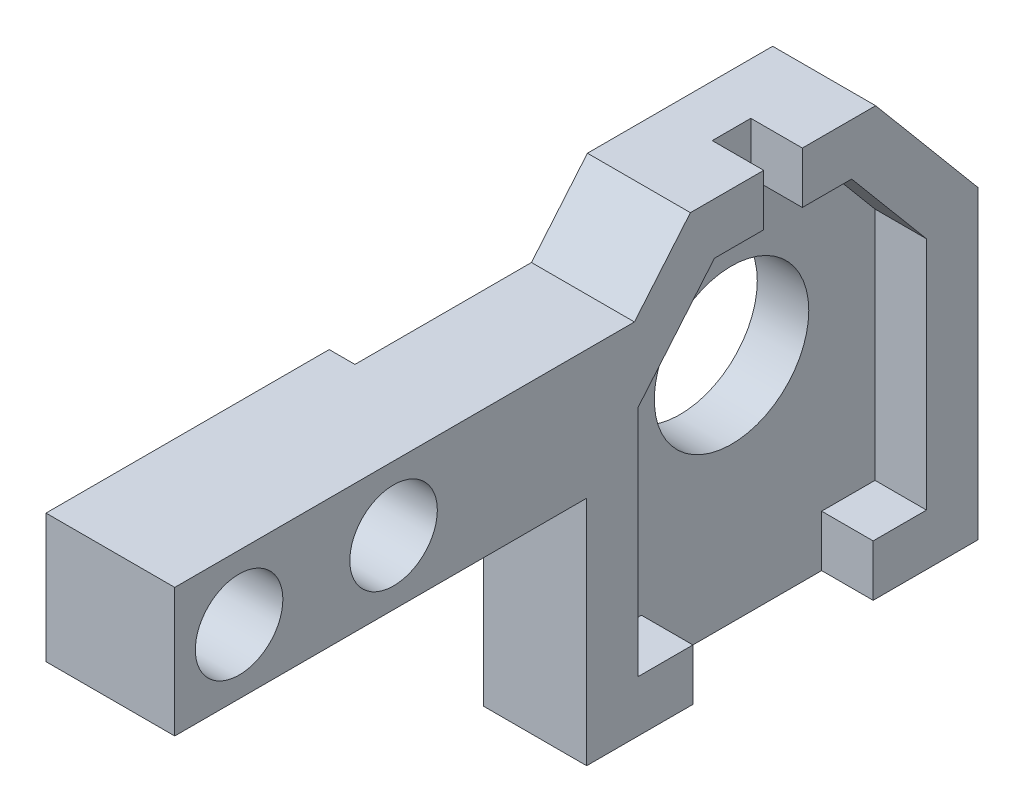
ISO-10303-21;
HEADER;
FILE_DESCRIPTION(('STEP AP214'),'2;1');
FILE_NAME('part.step','',(''),(''),'','','');
FILE_SCHEMA(('AUTOMOTIVE_DESIGN { 1 0 10303 214 1 1 1 1 }'));
ENDSEC;
DATA;
#1=APPLICATION_CONTEXT('core data for automotive mechanical design processes');
#2=APPLICATION_PROTOCOL_DEFINITION('international standard','automotive_design',2000,#1);
#3=PRODUCT_CONTEXT('',#1,'mechanical');
#4=PRODUCT('Part','Part','',(#3));
#5=PRODUCT_RELATED_PRODUCT_CATEGORY('part','',(#4));
#6=PRODUCT_DEFINITION_FORMATION('','',#4);
#7=PRODUCT_DEFINITION_CONTEXT('part definition',#1,'design');
#8=PRODUCT_DEFINITION('design','',#6,#7);
#9=PRODUCT_DEFINITION_SHAPE('','',#8);
#10=(LENGTH_UNIT() NAMED_UNIT(*) SI_UNIT(.MILLI.,.METRE.));
#11=(NAMED_UNIT(*) PLANE_ANGLE_UNIT() SI_UNIT($,.RADIAN.));
#12=(NAMED_UNIT(*) SI_UNIT($,.STERADIAN.) SOLID_ANGLE_UNIT());
#13=UNCERTAINTY_MEASURE_WITH_UNIT(LENGTH_MEASURE(1.E-05),#10,'distance_accuracy_value','');
#14=(GEOMETRIC_REPRESENTATION_CONTEXT(3) GLOBAL_UNCERTAINTY_ASSIGNED_CONTEXT((#13)) GLOBAL_UNIT_ASSIGNED_CONTEXT((#10,
#11,#12)) REPRESENTATION_CONTEXT('',''));
#15=CARTESIAN_POINT('',(0.,0.,0.));
#16=DIRECTION('',(0.,0.,1.));
#17=DIRECTION('',(1.,0.,0.));
#18=AXIS2_PLACEMENT_3D('',#15,#16,#17);
#19=CARTESIAN_POINT('',(0.,0.,0.));
#20=DIRECTION('',(-1.,0.,0.));
#21=DIRECTION('',(0.,0.,1.));
#22=AXIS2_PLACEMENT_3D('',#19,#20,#21);
#23=PLANE('',#22);
#24=CARTESIAN_POINT('',(0.,1.90865976235804,0.482116569244563));
#25=DIRECTION('',(1.,0.,0.));
#26=DIRECTION('',(0.,0.,-1.));
#27=AXIS2_PLACEMENT_3D('',#24,#25,#26);
#28=CIRCLE('',#27,3.);
#29=CARTESIAN_POINT('',(0.,1.90865976235804,-2.51788343075544));
#30=VERTEX_POINT('',#29);
#31=EDGE_CURVE('E228',#30,#30,#28,.T.);
#32=ORIENTED_EDGE('',*,*,#31,.F.);
#33=EDGE_LOOP('',(#32));
#34=FACE_BOUND('',#33,.T.);
#35=DIRECTION('',(0.,1.,0.));
#36=VECTOR('',#35,1.);
#37=CARTESIAN_POINT('',(0.,7.49865976235804,1.23211656924456));
#38=LINE('',#37,#36);
#39=CARTESIAN_POINT('',(0.,7.49865976235804,1.23211656924456));
#40=VERTEX_POINT('',#39);
#41=CARTESIAN_POINT('',(0.,9.49865976235804,1.23211656924456));
#42=VERTEX_POINT('',#41);
#43=EDGE_CURVE('E65',#40,#42,#38,.T.);
#44=ORIENTED_EDGE('',*,*,#43,.F.);
#45=DIRECTION('',(0.,0.,-1.));
#46=VECTOR('',#45,1.);
#47=CARTESIAN_POINT('',(0.,7.49865976235804,3.14728681258254));
#48=LINE('',#47,#46);
#49=CARTESIAN_POINT('',(0.,7.49865976235804,3.14728681258254));
#50=VERTEX_POINT('',#49);
#51=EDGE_CURVE('E403',#50,#40,#48,.T.);
#52=ORIENTED_EDGE('',*,*,#51,.F.);
#53=DIRECTION('',(0.,0.766044443118982,-0.642787609686534));
#54=VECTOR('',#53,1.);
#55=CARTESIAN_POINT('',(0.,3.96865976235804,6.1093085106383));
#56=LINE('',#55,#54);
#57=CARTESIAN_POINT('',(0.,3.96865976235804,6.1093085106383));
#58=VERTEX_POINT('',#57);
#59=EDGE_CURVE('E399',#58,#50,#56,.T.);
#60=ORIENTED_EDGE('',*,*,#59,.F.);
#61=DIRECTION('',(0.,1.,0.));
#62=VECTOR('',#61,1.);
#63=CARTESIAN_POINT('',(0.,3.96865976235804,6.1093085106383));
#64=LINE('',#63,#62);
#65=CARTESIAN_POINT('',(0.,-5.09134023764196,6.1093085106383));
#66=VERTEX_POINT('',#65);
#67=EDGE_CURVE('E394',#66,#58,#64,.T.);
#68=ORIENTED_EDGE('',*,*,#67,.F.);
#69=DIRECTION('',(0.,0.,1.));
#70=VECTOR('',#69,1.);
#71=CARTESIAN_POINT('',(0.,-5.09134023764196,6.1093085106383));
#72=LINE('',#71,#70);
#73=CARTESIAN_POINT('',(0.,-5.09134023764196,3.98211656924456));
#74=VERTEX_POINT('',#73);
#75=EDGE_CURVE('E390',#74,#66,#72,.T.);
#76=ORIENTED_EDGE('',*,*,#75,.F.);
#77=DIRECTION('',(0.,1.,0.));
#78=VECTOR('',#77,1.);
#79=CARTESIAN_POINT('',(0.,-5.09134023764196,3.98211656924456));
#80=LINE('',#79,#78);
#81=CARTESIAN_POINT('',(0.,-7.09134023764196,3.98211656924456));
#82=VERTEX_POINT('',#81);
#83=EDGE_CURVE('E408',#82,#74,#80,.T.);
#84=ORIENTED_EDGE('',*,*,#83,.F.);
#85=DIRECTION('',(0.,0.,-1.));
#86=VECTOR('',#85,1.);
#87=CARTESIAN_POINT('',(0.,-7.09134023764196,-7.0906914893617));
#88=LINE('',#87,#86);
#89=CARTESIAN_POINT('',(0.,-7.09134023764196,-3.01788343075544));
#90=VERTEX_POINT('',#89);
#91=EDGE_CURVE('E248',#82,#90,#88,.T.);
#92=ORIENTED_EDGE('',*,*,#91,.T.);
#93=DIRECTION('',(0.,-1.,0.));
#94=VECTOR('',#93,1.);
#95=CARTESIAN_POINT('',(0.,-5.09134023764196,-3.01788343075544));
#96=LINE('',#95,#94);
#97=CARTESIAN_POINT('',(0.,-5.09134023764196,-3.01788343075544));
#98=VERTEX_POINT('',#97);
#99=EDGE_CURVE('E311',#98,#90,#96,.T.);
#100=ORIENTED_EDGE('',*,*,#99,.F.);
#101=DIRECTION('',(0.,0.,1.));
#102=VECTOR('',#101,1.);
#103=CARTESIAN_POINT('',(0.,-5.09134023764196,-3.01788343075544));
#104=LINE('',#103,#102);
#105=CARTESIAN_POINT('',(0.,-5.09134023764196,-5.0906914893617));
#106=VERTEX_POINT('',#105);
#107=EDGE_CURVE('E307',#106,#98,#104,.T.);
#108=ORIENTED_EDGE('',*,*,#107,.F.);
#109=DIRECTION('',(0.,-1.,0.));
#110=VECTOR('',#109,1.);
#111=CARTESIAN_POINT('',(0.,4.03347195004924,-5.0906914893617));
#112=LINE('',#111,#110);
#113=CARTESIAN_POINT('',(0.,4.03347195004924,-5.0906914893617));
#114=VERTEX_POINT('',#113);
#115=EDGE_CURVE('E303',#114,#106,#112,.T.);
#116=ORIENTED_EDGE('',*,*,#115,.F.);
#117=DIRECTION('',(0.,-0.766044443118981,-0.642787609686535));
#118=VECTOR('',#117,1.);
#119=CARTESIAN_POINT('',(0.,4.03347195004924,-5.0906914893617));
#120=LINE('',#119,#118);
#121=CARTESIAN_POINT('',(0.,7.49865976235804,-2.18305367409341));
#122=VERTEX_POINT('',#121);
#123=EDGE_CURVE('E298',#122,#114,#120,.T.);
#124=ORIENTED_EDGE('',*,*,#123,.F.);
#125=DIRECTION('',(0.,0.,-1.));
#126=VECTOR('',#125,1.);
#127=CARTESIAN_POINT('',(0.,7.49865976235804,-0.267883430755437));
#128=LINE('',#127,#126);
#129=CARTESIAN_POINT('',(0.,7.49865976235804,-0.267883430755437));
#130=VERTEX_POINT('',#129);
#131=EDGE_CURVE('E294',#130,#122,#128,.T.);
#132=ORIENTED_EDGE('',*,*,#131,.F.);
#133=DIRECTION('',(0.,-1.,0.));
#134=VECTOR('',#133,1.);
#135=CARTESIAN_POINT('',(0.,7.49865976235804,-0.267883430755437));
#136=LINE('',#135,#134);
#137=CARTESIAN_POINT('',(0.,9.49865976235804,-0.267883430755437));
#138=VERTEX_POINT('',#137);
#139=EDGE_CURVE('E315',#138,#130,#136,.T.);
#140=ORIENTED_EDGE('',*,*,#139,.F.);
#141=DIRECTION('',(0.,0.,1.));
#142=VECTOR('',#141,1.);
#143=CARTESIAN_POINT('',(0.,9.49865976235804,4.07990212889255));
#144=LINE('',#143,#142);
#145=EDGE_CURVE('E251',#138,#42,#144,.T.);
#146=ORIENTED_EDGE('',*,*,#145,.T.);
#147=EDGE_LOOP('',(#44,#52,#60,#68,#76,#84,#92,#100,#108,#116,#124,#132,#140,#146));
#148=FACE_BOUND('',#147,.T.);
#149=ADVANCED_FACE('F39',(#34,#148),#23,.F.);
#150=CARTESIAN_POINT('',(-2.,-7.09134023764196,-7.0906914893617));
#151=DIRECTION('',(0.,-1.,0.));
#152=DIRECTION('',(0.,0.,-1.));
#153=AXIS2_PLACEMENT_3D('',#150,#151,#152);
#154=PLANE('',#153);
#155=ORIENTED_EDGE('',*,*,#91,.F.);
#156=DIRECTION('',(-1.,0.,0.));
#157=VECTOR('',#156,1.);
#158=CARTESIAN_POINT('',(2.,-7.09134023764196,3.98211656924456));
#159=LINE('',#158,#157);
#160=CARTESIAN_POINT('',(2.,-7.09134023764196,3.98211656924456));
#161=VERTEX_POINT('',#160);
#162=EDGE_CURVE('E416',#161,#82,#159,.T.);
#163=ORIENTED_EDGE('',*,*,#162,.F.);
#164=DIRECTION('',(0.,0.,-1.));
#165=VECTOR('',#164,1.);
#166=CARTESIAN_POINT('',(2.,-7.09134023764196,8.1093085106383));
#167=LINE('',#166,#165);
#168=CARTESIAN_POINT('',(2.,-7.09134023764196,8.1093085106383));
#169=VERTEX_POINT('',#168);
#170=EDGE_CURVE('E378',#169,#161,#167,.T.);
#171=ORIENTED_EDGE('',*,*,#170,.F.);
#172=DIRECTION('',(1.,0.,0.));
#173=VECTOR('',#172,1.);
#174=CARTESIAN_POINT('',(-2.,-7.09134023764196,8.1093085106383));
#175=LINE('',#174,#173);
#176=CARTESIAN_POINT('',(-2.,-7.09134023764196,8.1093085106383));
#177=VERTEX_POINT('',#176);
#178=EDGE_CURVE('E11',#177,#169,#175,.T.);
#179=ORIENTED_EDGE('',*,*,#178,.F.);
#180=DIRECTION('',(0.,0.,-1.));
#181=VECTOR('',#180,1.);
#182=CARTESIAN_POINT('',(-2.,-7.09134023764196,-7.0906914893617));
#183=LINE('',#182,#181);
#184=CARTESIAN_POINT('',(-2.,-7.09134023764196,-7.0906914893617));
#185=VERTEX_POINT('',#184);
#186=EDGE_CURVE('E236',#177,#185,#183,.T.);
#187=ORIENTED_EDGE('',*,*,#186,.T.);
#188=DIRECTION('',(1.,0.,0.));
#189=VECTOR('',#188,1.);
#190=CARTESIAN_POINT('',(-2.,-7.09134023764196,-7.0906914893617));
#191=LINE('',#190,#189);
#192=CARTESIAN_POINT('',(2.,-7.09134023764196,-7.0906914893617));
#193=VERTEX_POINT('',#192);
#194=EDGE_CURVE('E43',#185,#193,#191,.T.);
#195=ORIENTED_EDGE('',*,*,#194,.T.);
#196=DIRECTION('',(0.,0.,-1.));
#197=VECTOR('',#196,1.);
#198=CARTESIAN_POINT('',(2.,-7.09134023764196,-3.01788343075544));
#199=LINE('',#198,#197);
#200=CARTESIAN_POINT('',(2.,-7.09134023764196,-3.01788343075544));
#201=VERTEX_POINT('',#200);
#202=EDGE_CURVE('E279',#201,#193,#199,.T.);
#203=ORIENTED_EDGE('',*,*,#202,.F.);
#204=DIRECTION('',(-1.,0.,0.));
#205=VECTOR('',#204,1.);
#206=CARTESIAN_POINT('',(2.,-7.09134023764196,-3.01788343075544));
#207=LINE('',#206,#205);
#208=EDGE_CURVE('E327',#201,#90,#207,.T.);
#209=ORIENTED_EDGE('',*,*,#208,.T.);
#210=EDGE_LOOP('',(#155,#163,#171,#179,#187,#195,#203,#209));
#211=FACE_BOUND('',#210,.T.);
#212=ADVANCED_FACE('F41',(#211),#154,.T.);
#213=CARTESIAN_POINT('',(-2.,-7.09134023764196,8.1093085106383));
#214=DIRECTION('',(0.,0.,1.));
#215=DIRECTION('',(0.,-1.,0.));
#216=AXIS2_PLACEMENT_3D('',#213,#214,#215);
#217=PLANE('',#216);
#218=DIRECTION('',(1.,0.,0.));
#219=VECTOR('',#218,1.);
#220=CARTESIAN_POINT('',(-3.,1.90865976235804,8.1093085106383));
#221=LINE('',#220,#219);
#222=CARTESIAN_POINT('',(-2.,1.90865976235804,8.1093085106383));
#223=VERTEX_POINT('',#222);
#224=CARTESIAN_POINT('',(2.,1.90865976235804,8.1093085106383));
#225=VERTEX_POINT('',#224);
#226=EDGE_CURVE('E211',#223,#225,#221,.T.);
#227=ORIENTED_EDGE('',*,*,#226,.F.);
#228=DIRECTION('',(0.,-1.,0.));
#229=VECTOR('',#228,1.);
#230=CARTESIAN_POINT('',(-2.,-7.09134023764196,8.1093085106383));
#231=LINE('',#230,#229);
#232=EDGE_CURVE('E224',#223,#177,#231,.T.);
#233=ORIENTED_EDGE('',*,*,#232,.T.);
#234=ORIENTED_EDGE('',*,*,#178,.T.);
#235=DIRECTION('',(0.,-1.,0.));
#236=VECTOR('',#235,1.);
#237=CARTESIAN_POINT('',(2.,4.69660023089044,8.1093085106383));
#238=LINE('',#237,#236);
#239=EDGE_CURVE('E226',#225,#169,#238,.T.);
#240=ORIENTED_EDGE('',*,*,#239,.F.);
#241=EDGE_LOOP('',(#227,#233,#234,#240));
#242=FACE_BOUND('',#241,.T.);
#243=ADVANCED_FACE('F223',(#242),#217,.T.);
#244=CARTESIAN_POINT('',(-2.,4.69660023089044,8.1093085106383));
#245=DIRECTION('',(0.,0.642787609686534,0.766044443118982));
#246=DIRECTION('',(0.,-0.766044443118982,0.642787609686534));
#247=AXIS2_PLACEMENT_3D('',#244,#245,#246);
#248=PLANE('',#247);
#249=DIRECTION('',(1.,0.,0.));
#250=VECTOR('',#249,1.);
#251=CARTESIAN_POINT('',(-3.,6.90865976235804,6.25317017364167));
#252=LINE('',#251,#250);
#253=CARTESIAN_POINT('',(-2.,6.90865976235804,6.25317017364167));
#254=VERTEX_POINT('',#253);
#255=CARTESIAN_POINT('',(2.,6.90865976235804,6.25317017364167));
#256=VERTEX_POINT('',#255);
#257=EDGE_CURVE('E368',#254,#256,#252,.T.);
#258=ORIENTED_EDGE('',*,*,#257,.T.);
#259=DIRECTION('',(0.,-0.766044443118982,0.642787609686534));
#260=VECTOR('',#259,1.);
#261=CARTESIAN_POINT('',(2.,4.69660023089044,8.1093085106383));
#262=LINE('',#261,#260);
#263=CARTESIAN_POINT('',(2.,9.49865976235804,4.07990212889255));
#264=VERTEX_POINT('',#263);
#265=EDGE_CURVE('E370',#264,#256,#262,.T.);
#266=ORIENTED_EDGE('',*,*,#265,.F.);
#267=DIRECTION('',(1.,0.,0.));
#268=VECTOR('',#267,1.);
#269=CARTESIAN_POINT('',(-2.,9.49865976235804,4.07990212889255));
#270=LINE('',#269,#268);
#271=CARTESIAN_POINT('',(-2.,9.49865976235804,4.07990212889255));
#272=VERTEX_POINT('',#271);
#273=EDGE_CURVE('E49',#272,#264,#270,.T.);
#274=ORIENTED_EDGE('',*,*,#273,.F.);
#275=DIRECTION('',(0.,-0.766044443118982,0.642787609686534));
#276=VECTOR('',#275,1.);
#277=CARTESIAN_POINT('',(-2.,4.69660023089044,8.1093085106383));
#278=LINE('',#277,#276);
#279=EDGE_CURVE('E238',#272,#254,#278,.T.);
#280=ORIENTED_EDGE('',*,*,#279,.T.);
#281=EDGE_LOOP('',(#258,#266,#274,#280));
#282=FACE_BOUND('',#281,.T.);
#283=ADVANCED_FACE('F366',(#282),#248,.T.);
#284=CARTESIAN_POINT('',(-2.,9.49865976235804,4.07990212889255));
#285=DIRECTION('',(0.,1.,0.));
#286=DIRECTION('',(0.,0.,1.));
#287=AXIS2_PLACEMENT_3D('',#284,#285,#286);
#288=PLANE('',#287);
#289=ORIENTED_EDGE('',*,*,#145,.F.);
#290=DIRECTION('',(-1.,0.,0.));
#291=VECTOR('',#290,1.);
#292=CARTESIAN_POINT('',(2.,9.49865976235804,-0.267883430755437));
#293=LINE('',#292,#291);
#294=CARTESIAN_POINT('',(2.,9.49865976235804,-0.267883430755437));
#295=VERTEX_POINT('',#294);
#296=EDGE_CURVE('E323',#295,#138,#293,.T.);
#297=ORIENTED_EDGE('',*,*,#296,.F.);
#298=DIRECTION('',(0.,0.,1.));
#299=VECTOR('',#298,1.);
#300=CARTESIAN_POINT('',(2.,9.49865976235804,-0.267883430755437));
#301=LINE('',#300,#299);
#302=CARTESIAN_POINT('',(2.,9.49865976235804,-3.11566899040342));
#303=VERTEX_POINT('',#302);
#304=EDGE_CURVE('E284',#303,#295,#301,.T.);
#305=ORIENTED_EDGE('',*,*,#304,.F.);
#306=DIRECTION('',(1.,0.,0.));
#307=VECTOR('',#306,1.);
#308=CARTESIAN_POINT('',(-2.,9.49865976235804,-3.11566899040342));
#309=LINE('',#308,#307);
#310=CARTESIAN_POINT('',(-2.,9.49865976235804,-3.11566899040342));
#311=VERTEX_POINT('',#310);
#312=EDGE_CURVE('E257',#311,#303,#309,.T.);
#313=ORIENTED_EDGE('',*,*,#312,.F.);
#314=DIRECTION('',(0.,0.,1.));
#315=VECTOR('',#314,1.);
#316=CARTESIAN_POINT('',(-2.,9.49865976235804,4.07990212889255));
#317=LINE('',#316,#315);
#318=EDGE_CURVE('E244',#311,#272,#317,.T.);
#319=ORIENTED_EDGE('',*,*,#318,.T.);
#320=ORIENTED_EDGE('',*,*,#273,.T.);
#321=DIRECTION('',(0.,0.,1.));
#322=VECTOR('',#321,1.);
#323=CARTESIAN_POINT('',(2.,9.49865976235804,4.07990212889255));
#324=LINE('',#323,#322);
#325=CARTESIAN_POINT('',(2.,9.49865976235804,1.23211656924456));
#326=VERTEX_POINT('',#325);
#327=EDGE_CURVE('E374',#326,#264,#324,.T.);
#328=ORIENTED_EDGE('',*,*,#327,.F.);
#329=DIRECTION('',(-1.,0.,0.));
#330=VECTOR('',#329,1.);
#331=CARTESIAN_POINT('',(2.,9.49865976235804,1.23211656924456));
#332=LINE('',#331,#330);
#333=EDGE_CURVE('E420',#326,#42,#332,.T.);
#334=ORIENTED_EDGE('',*,*,#333,.T.);
#335=EDGE_LOOP('',(#289,#297,#305,#313,#319,#320,#328,#334));
#336=FACE_BOUND('',#335,.T.);
#337=ADVANCED_FACE('F357',(#336),#288,.T.);
#338=CARTESIAN_POINT('',(-2.,9.49865976235804,-3.11566899040342));
#339=DIRECTION('',(0.,0.642787609686535,-0.766044443118981));
#340=DIRECTION('',(0.,0.766044443118982,0.642787609686535));
#341=AXIS2_PLACEMENT_3D('',#338,#339,#340);
#342=PLANE('',#341);
#343=ORIENTED_EDGE('',*,*,#312,.T.);
#344=DIRECTION('',(0.,0.766044443118982,0.642787609686535));
#345=VECTOR('',#344,1.);
#346=CARTESIAN_POINT('',(2.,9.49865976235804,-3.11566899040342));
#347=LINE('',#346,#345);
#348=CARTESIAN_POINT('',(2.,4.76141241858164,-7.0906914893617));
#349=VERTEX_POINT('',#348);
#350=EDGE_CURVE('E276',#349,#303,#347,.T.);
#351=ORIENTED_EDGE('',*,*,#350,.F.);
#352=DIRECTION('',(1.,0.,0.));
#353=VECTOR('',#352,1.);
#354=CARTESIAN_POINT('',(-2.,4.76141241858164,-7.0906914893617));
#355=LINE('',#354,#353);
#356=CARTESIAN_POINT('',(-2.,4.76141241858164,-7.0906914893617));
#357=VERTEX_POINT('',#356);
#358=EDGE_CURVE('E242',#357,#349,#355,.T.);
#359=ORIENTED_EDGE('',*,*,#358,.F.);
#360=DIRECTION('',(0.,0.766044443118982,0.642787609686535));
#361=VECTOR('',#360,1.);
#362=CARTESIAN_POINT('',(-2.,9.49865976235804,-3.11566899040342));
#363=LINE('',#362,#361);
#364=EDGE_CURVE('E350',#357,#311,#363,.T.);
#365=ORIENTED_EDGE('',*,*,#364,.T.);
#366=EDGE_LOOP('',(#343,#351,#359,#365));
#367=FACE_BOUND('',#366,.T.);
#368=ADVANCED_FACE('F282',(#367),#342,.T.);
#369=CARTESIAN_POINT('',(-2.,4.76141241858164,-7.0906914893617));
#370=DIRECTION('',(0.,0.,-1.));
#371=DIRECTION('',(0.,1.,0.));
#372=AXIS2_PLACEMENT_3D('',#369,#370,#371);
#373=PLANE('',#372);
#374=ORIENTED_EDGE('',*,*,#358,.T.);
#375=DIRECTION('',(0.,1.,0.));
#376=VECTOR('',#375,1.);
#377=CARTESIAN_POINT('',(2.,4.76141241858164,-7.0906914893617));
#378=LINE('',#377,#376);
#379=EDGE_CURVE('E265',#193,#349,#378,.T.);
#380=ORIENTED_EDGE('',*,*,#379,.F.);
#381=ORIENTED_EDGE('',*,*,#194,.F.);
#382=DIRECTION('',(0.,1.,0.));
#383=VECTOR('',#382,1.);
#384=CARTESIAN_POINT('',(-2.,4.76141241858164,-7.0906914893617));
#385=LINE('',#384,#383);
#386=EDGE_CURVE('E266',#185,#357,#385,.T.);
#387=ORIENTED_EDGE('',*,*,#386,.T.);
#388=EDGE_LOOP('',(#374,#380,#381,#387));
#389=FACE_BOUND('',#388,.T.);
#390=ADVANCED_FACE('F264',(#389),#373,.T.);
#391=CARTESIAN_POINT('',(-2.,0.,0.));
#392=DIRECTION('',(-1.,0.,0.));
#393=DIRECTION('',(0.,0.,1.));
#394=AXIS2_PLACEMENT_3D('',#391,#392,#393);
#395=PLANE('',#394);
#396=ORIENTED_EDGE('',*,*,#232,.F.);
#397=DIRECTION('',(0.,0.,1.));
#398=VECTOR('',#397,1.);
#399=CARTESIAN_POINT('',(-2.,1.90865976235804,13.1093085106383));
#400=LINE('',#399,#398);
#401=CARTESIAN_POINT('',(-2.,1.90865976235804,13.1093085106383));
#402=VERTEX_POINT('',#401);
#403=EDGE_CURVE('E208',#223,#402,#400,.T.);
#404=ORIENTED_EDGE('',*,*,#403,.T.);
#405=DIRECTION('',(0.,1.,0.));
#406=VECTOR('',#405,1.);
#407=CARTESIAN_POINT('',(-2.,6.90865976235804,13.1093085106383));
#408=LINE('',#407,#406);
#409=CARTESIAN_POINT('',(-2.,6.90865976235804,13.1093085106383));
#410=VERTEX_POINT('',#409);
#411=EDGE_CURVE('E218',#402,#410,#408,.T.);
#412=ORIENTED_EDGE('',*,*,#411,.T.);
#413=DIRECTION('',(0.,0.,-1.));
#414=VECTOR('',#413,1.);
#415=CARTESIAN_POINT('',(-2.,6.90865976235804,8.1093085106383));
#416=LINE('',#415,#414);
#417=EDGE_CURVE('E362',#410,#254,#416,.T.);
#418=ORIENTED_EDGE('',*,*,#417,.T.);
#419=ORIENTED_EDGE('',*,*,#279,.F.);
#420=ORIENTED_EDGE('',*,*,#318,.F.);
#421=ORIENTED_EDGE('',*,*,#364,.F.);
#422=ORIENTED_EDGE('',*,*,#386,.F.);
#423=ORIENTED_EDGE('',*,*,#186,.F.);
#424=EDGE_LOOP('',(#396,#404,#412,#418,#419,#420,#421,#422,#423));
#425=FACE_BOUND('',#424,.T.);
#426=CARTESIAN_POINT('',(-2.,1.90865976235804,0.482116569244563));
#427=DIRECTION('',(1.,0.,0.));
#428=DIRECTION('',(0.,0.,-1.));
#429=AXIS2_PLACEMENT_3D('',#426,#427,#428);
#430=CIRCLE('',#429,3.);
#431=CARTESIAN_POINT('',(-2.,1.90865976235804,-2.51788343075544));
#432=VERTEX_POINT('',#431);
#433=EDGE_CURVE('E395',#432,#432,#430,.T.);
#434=ORIENTED_EDGE('',*,*,#433,.T.);
#435=EDGE_LOOP('',(#434));
#436=FACE_BOUND('',#435,.T.);
#437=ADVANCED_FACE('F232',(#425,#436),#395,.T.);
#438=CARTESIAN_POINT('',(2.,7.49865976235804,-0.267883430755437));
#439=DIRECTION('',(0.,1.,0.));
#440=DIRECTION('',(0.,0.,1.));
#441=AXIS2_PLACEMENT_3D('',#438,#439,#440);
#442=PLANE('',#441);
#443=ORIENTED_EDGE('',*,*,#131,.T.);
#444=DIRECTION('',(-1.,0.,0.));
#445=VECTOR('',#444,1.);
#446=CARTESIAN_POINT('',(2.,7.49865976235804,-2.18305367409341));
#447=LINE('',#446,#445);
#448=CARTESIAN_POINT('',(2.,7.49865976235804,-2.18305367409341));
#449=VERTEX_POINT('',#448);
#450=EDGE_CURVE('E252',#449,#122,#447,.T.);
#451=ORIENTED_EDGE('',*,*,#450,.F.);
#452=DIRECTION('',(0.,0.,-1.));
#453=VECTOR('',#452,1.);
#454=CARTESIAN_POINT('',(2.,7.49865976235804,-0.267883430755437));
#455=LINE('',#454,#453);
#456=CARTESIAN_POINT('',(2.,7.49865976235804,-0.267883430755437));
#457=VERTEX_POINT('',#456);
#458=EDGE_CURVE('E319',#457,#449,#455,.T.);
#459=ORIENTED_EDGE('',*,*,#458,.F.);
#460=DIRECTION('',(-1.,0.,0.));
#461=VECTOR('',#460,1.);
#462=CARTESIAN_POINT('',(2.,7.49865976235804,-0.267883430755437));
#463=LINE('',#462,#461);
#464=EDGE_CURVE('E293',#457,#130,#463,.T.);
#465=ORIENTED_EDGE('',*,*,#464,.T.);
#466=EDGE_LOOP('',(#443,#451,#459,#465));
#467=FACE_BOUND('',#466,.T.);
#468=ADVANCED_FACE('F524',(#467),#442,.F.);
#469=CARTESIAN_POINT('',(2.,4.03347195004924,-5.0906914893617));
#470=DIRECTION('',(0.,0.642787609686535,-0.766044443118982));
#471=DIRECTION('',(0.,0.766044443118982,0.642787609686535));
#472=AXIS2_PLACEMENT_3D('',#469,#470,#471);
#473=PLANE('',#472);
#474=ORIENTED_EDGE('',*,*,#123,.T.);
#475=DIRECTION('',(-1.,0.,0.));
#476=VECTOR('',#475,1.);
#477=CARTESIAN_POINT('',(2.,4.03347195004924,-5.0906914893617));
#478=LINE('',#477,#476);
#479=CARTESIAN_POINT('',(2.,4.03347195004924,-5.0906914893617));
#480=VERTEX_POINT('',#479);
#481=EDGE_CURVE('E339',#480,#114,#478,.T.);
#482=ORIENTED_EDGE('',*,*,#481,.F.);
#483=DIRECTION('',(0.,-0.766044443118981,-0.642787609686535));
#484=VECTOR('',#483,1.);
#485=CARTESIAN_POINT('',(2.,4.03347195004924,-5.0906914893617));
#486=LINE('',#485,#484);
#487=EDGE_CURVE('E441',#449,#480,#486,.T.);
#488=ORIENTED_EDGE('',*,*,#487,.F.);
#489=ORIENTED_EDGE('',*,*,#450,.T.);
#490=EDGE_LOOP('',(#474,#482,#488,#489));
#491=FACE_BOUND('',#490,.T.);
#492=ADVANCED_FACE('F526',(#491),#473,.F.);
#493=CARTESIAN_POINT('',(2.,4.03347195004924,-5.0906914893617));
#494=DIRECTION('',(0.,0.,-1.));
#495=DIRECTION('',(0.,1.,0.));
#496=AXIS2_PLACEMENT_3D('',#493,#494,#495);
#497=PLANE('',#496);
#498=ORIENTED_EDGE('',*,*,#115,.T.);
#499=DIRECTION('',(-1.,0.,0.));
#500=VECTOR('',#499,1.);
#501=CARTESIAN_POINT('',(2.,-5.09134023764196,-5.0906914893617));
#502=LINE('',#501,#500);
#503=CARTESIAN_POINT('',(2.,-5.09134023764196,-5.0906914893617));
#504=VERTEX_POINT('',#503);
#505=EDGE_CURVE('E335',#504,#106,#502,.T.);
#506=ORIENTED_EDGE('',*,*,#505,.F.);
#507=DIRECTION('',(0.,-1.,0.));
#508=VECTOR('',#507,1.);
#509=CARTESIAN_POINT('',(2.,4.03347195004924,-5.0906914893617));
#510=LINE('',#509,#508);
#511=EDGE_CURVE('E444',#480,#504,#510,.T.);
#512=ORIENTED_EDGE('',*,*,#511,.F.);
#513=ORIENTED_EDGE('',*,*,#481,.T.);
#514=EDGE_LOOP('',(#498,#506,#512,#513));
#515=FACE_BOUND('',#514,.T.);
#516=ADVANCED_FACE('F530',(#515),#497,.F.);
#517=CARTESIAN_POINT('',(2.,-5.09134023764196,-3.01788343075544));
#518=DIRECTION('',(0.,-1.,0.));
#519=DIRECTION('',(0.,0.,-1.));
#520=AXIS2_PLACEMENT_3D('',#517,#518,#519);
#521=PLANE('',#520);
#522=ORIENTED_EDGE('',*,*,#107,.T.);
#523=DIRECTION('',(-1.,0.,0.));
#524=VECTOR('',#523,1.);
#525=CARTESIAN_POINT('',(2.,-5.09134023764196,-3.01788343075544));
#526=LINE('',#525,#524);
#527=CARTESIAN_POINT('',(2.,-5.09134023764196,-3.01788343075544));
#528=VERTEX_POINT('',#527);
#529=EDGE_CURVE('E331',#528,#98,#526,.T.);
#530=ORIENTED_EDGE('',*,*,#529,.F.);
#531=DIRECTION('',(0.,0.,1.));
#532=VECTOR('',#531,1.);
#533=CARTESIAN_POINT('',(2.,-5.09134023764196,-3.01788343075544));
#534=LINE('',#533,#532);
#535=EDGE_CURVE('E447',#504,#528,#534,.T.);
#536=ORIENTED_EDGE('',*,*,#535,.F.);
#537=ORIENTED_EDGE('',*,*,#505,.T.);
#538=EDGE_LOOP('',(#522,#530,#536,#537));
#539=FACE_BOUND('',#538,.T.);
#540=ADVANCED_FACE('F532',(#539),#521,.F.);
#541=CARTESIAN_POINT('',(2.,-5.09134023764196,-3.01788343075544));
#542=DIRECTION('',(0.,0.,-1.));
#543=DIRECTION('',(0.,1.,0.));
#544=AXIS2_PLACEMENT_3D('',#541,#542,#543);
#545=PLANE('',#544);
#546=ORIENTED_EDGE('',*,*,#99,.T.);
#547=ORIENTED_EDGE('',*,*,#208,.F.);
#548=DIRECTION('',(0.,-1.,0.));
#549=VECTOR('',#548,1.);
#550=CARTESIAN_POINT('',(2.,-5.09134023764196,-3.01788343075544));
#551=LINE('',#550,#549);
#552=EDGE_CURVE('E450',#528,#201,#551,.T.);
#553=ORIENTED_EDGE('',*,*,#552,.F.);
#554=ORIENTED_EDGE('',*,*,#529,.T.);
#555=EDGE_LOOP('',(#546,#547,#553,#554));
#556=FACE_BOUND('',#555,.T.);
#557=ADVANCED_FACE('F458',(#556),#545,.F.);
#558=CARTESIAN_POINT('',(2.,7.49865976235804,-0.267883430755437));
#559=DIRECTION('',(0.,0.,-1.));
#560=DIRECTION('',(-1.,0.,0.));
#561=AXIS2_PLACEMENT_3D('',#558,#559,#560);
#562=PLANE('',#561);
#563=ORIENTED_EDGE('',*,*,#139,.T.);
#564=ORIENTED_EDGE('',*,*,#464,.F.);
#565=DIRECTION('',(0.,-1.,0.));
#566=VECTOR('',#565,1.);
#567=CARTESIAN_POINT('',(2.,7.49865976235804,-0.267883430755437));
#568=LINE('',#567,#566);
#569=EDGE_CURVE('E287',#295,#457,#568,.T.);
#570=ORIENTED_EDGE('',*,*,#569,.F.);
#571=ORIENTED_EDGE('',*,*,#296,.T.);
#572=EDGE_LOOP('',(#563,#564,#570,#571));
#573=FACE_BOUND('',#572,.T.);
#574=ADVANCED_FACE('F518',(#573),#562,.F.);
#575=CARTESIAN_POINT('',(2.,0.,0.));
#576=DIRECTION('',(-1.,0.,0.));
#577=DIRECTION('',(0.,0.,1.));
#578=AXIS2_PLACEMENT_3D('',#575,#576,#577);
#579=PLANE('',#578);
#580=ORIENTED_EDGE('',*,*,#458,.T.);
#581=ORIENTED_EDGE('',*,*,#487,.T.);
#582=ORIENTED_EDGE('',*,*,#511,.T.);
#583=ORIENTED_EDGE('',*,*,#535,.T.);
#584=ORIENTED_EDGE('',*,*,#552,.T.);
#585=ORIENTED_EDGE('',*,*,#202,.T.);
#586=ORIENTED_EDGE('',*,*,#379,.T.);
#587=ORIENTED_EDGE('',*,*,#350,.T.);
#588=ORIENTED_EDGE('',*,*,#304,.T.);
#589=ORIENTED_EDGE('',*,*,#569,.T.);
#590=EDGE_LOOP('',(#580,#581,#582,#583,#584,#585,#586,#587,#588,#589));
#591=FACE_BOUND('',#590,.T.);
#592=ADVANCED_FACE('F275',(#591),#579,.F.);
#593=CARTESIAN_POINT('',(2.,-5.09134023764196,6.1093085106383));
#594=DIRECTION('',(0.,-1.,0.));
#595=DIRECTION('',(0.,0.,-1.));
#596=AXIS2_PLACEMENT_3D('',#593,#594,#595);
#597=PLANE('',#596);
#598=ORIENTED_EDGE('',*,*,#75,.T.);
#599=DIRECTION('',(-1.,0.,0.));
#600=VECTOR('',#599,1.);
#601=CARTESIAN_POINT('',(2.,-5.09134023764196,6.1093085106383));
#602=LINE('',#601,#600);
#603=CARTESIAN_POINT('',(2.,-5.09134023764196,6.1093085106383));
#604=VERTEX_POINT('',#603);
#605=EDGE_CURVE('E299',#604,#66,#602,.T.);
#606=ORIENTED_EDGE('',*,*,#605,.F.);
#607=DIRECTION('',(0.,0.,1.));
#608=VECTOR('',#607,1.);
#609=CARTESIAN_POINT('',(2.,-5.09134023764196,6.1093085106383));
#610=LINE('',#609,#608);
#611=CARTESIAN_POINT('',(2.,-5.09134023764196,3.98211656924456));
#612=VERTEX_POINT('',#611);
#613=EDGE_CURVE('E412',#612,#604,#610,.T.);
#614=ORIENTED_EDGE('',*,*,#613,.F.);
#615=DIRECTION('',(-1.,0.,0.));
#616=VECTOR('',#615,1.);
#617=CARTESIAN_POINT('',(2.,-5.09134023764196,3.98211656924456));
#618=LINE('',#617,#616);
#619=EDGE_CURVE('E389',#612,#74,#618,.T.);
#620=ORIENTED_EDGE('',*,*,#619,.T.);
#621=EDGE_LOOP('',(#598,#606,#614,#620));
#622=FACE_BOUND('',#621,.T.);
#623=ADVANCED_FACE('F538',(#622),#597,.F.);
#624=CARTESIAN_POINT('',(2.,3.96865976235804,6.1093085106383));
#625=DIRECTION('',(0.,0.,1.));
#626=DIRECTION('',(0.,-1.,0.));
#627=AXIS2_PLACEMENT_3D('',#624,#625,#626);
#628=PLANE('',#627);
#629=ORIENTED_EDGE('',*,*,#67,.T.);
#630=DIRECTION('',(-1.,0.,0.));
#631=VECTOR('',#630,1.);
#632=CARTESIAN_POINT('',(2.,3.96865976235804,6.1093085106383));
#633=LINE('',#632,#631);
#634=CARTESIAN_POINT('',(2.,3.96865976235804,6.1093085106383));
#635=VERTEX_POINT('',#634);
#636=EDGE_CURVE('E432',#635,#58,#633,.T.);
#637=ORIENTED_EDGE('',*,*,#636,.F.);
#638=DIRECTION('',(0.,1.,0.));
#639=VECTOR('',#638,1.);
#640=CARTESIAN_POINT('',(2.,3.96865976235804,6.1093085106383));
#641=LINE('',#640,#639);
#642=EDGE_CURVE('E500',#604,#635,#641,.T.);
#643=ORIENTED_EDGE('',*,*,#642,.F.);
#644=ORIENTED_EDGE('',*,*,#605,.T.);
#645=EDGE_LOOP('',(#629,#637,#643,#644));
#646=FACE_BOUND('',#645,.T.);
#647=ADVANCED_FACE('F543',(#646),#628,.F.);
#648=CARTESIAN_POINT('',(2.,3.96865976235804,6.1093085106383));
#649=DIRECTION('',(0.,0.642787609686534,0.766044443118982));
#650=DIRECTION('',(0.,-0.766044443118982,0.642787609686534));
#651=AXIS2_PLACEMENT_3D('',#648,#649,#650);
#652=PLANE('',#651);
#653=ORIENTED_EDGE('',*,*,#59,.T.);
#654=DIRECTION('',(-1.,0.,0.));
#655=VECTOR('',#654,1.);
#656=CARTESIAN_POINT('',(2.,7.49865976235804,3.14728681258254));
#657=LINE('',#656,#655);
#658=CARTESIAN_POINT('',(2.,7.49865976235804,3.14728681258254));
#659=VERTEX_POINT('',#658);
#660=EDGE_CURVE('E428',#659,#50,#657,.T.);
#661=ORIENTED_EDGE('',*,*,#660,.F.);
#662=DIRECTION('',(0.,0.766044443118982,-0.642787609686534));
#663=VECTOR('',#662,1.);
#664=CARTESIAN_POINT('',(2.,3.96865976235804,6.1093085106383));
#665=LINE('',#664,#663);
#666=EDGE_CURVE('E503',#635,#659,#665,.T.);
#667=ORIENTED_EDGE('',*,*,#666,.F.);
#668=ORIENTED_EDGE('',*,*,#636,.T.);
#669=EDGE_LOOP('',(#653,#661,#667,#668));
#670=FACE_BOUND('',#669,.T.);
#671=ADVANCED_FACE('F545',(#670),#652,.F.);
#672=CARTESIAN_POINT('',(2.,7.49865976235804,3.14728681258254));
#673=DIRECTION('',(0.,1.,0.));
#674=DIRECTION('',(0.,0.,1.));
#675=AXIS2_PLACEMENT_3D('',#672,#673,#674);
#676=PLANE('',#675);
#677=ORIENTED_EDGE('',*,*,#51,.T.);
#678=DIRECTION('',(-1.,0.,0.));
#679=VECTOR('',#678,1.);
#680=CARTESIAN_POINT('',(2.,7.49865976235804,1.23211656924456));
#681=LINE('',#680,#679);
#682=CARTESIAN_POINT('',(2.,7.49865976235804,1.23211656924456));
#683=VERTEX_POINT('',#682);
#684=EDGE_CURVE('E424',#683,#40,#681,.T.);
#685=ORIENTED_EDGE('',*,*,#684,.F.);
#686=DIRECTION('',(0.,0.,-1.));
#687=VECTOR('',#686,1.);
#688=CARTESIAN_POINT('',(2.,7.49865976235804,3.14728681258254));
#689=LINE('',#688,#687);
#690=EDGE_CURVE('E506',#659,#683,#689,.T.);
#691=ORIENTED_EDGE('',*,*,#690,.F.);
#692=ORIENTED_EDGE('',*,*,#660,.T.);
#693=EDGE_LOOP('',(#677,#685,#691,#692));
#694=FACE_BOUND('',#693,.T.);
#695=ADVANCED_FACE('F547',(#694),#676,.F.);
#696=CARTESIAN_POINT('',(2.,7.49865976235804,1.23211656924456));
#697=DIRECTION('',(0.,0.,1.));
#698=DIRECTION('',(1.,0.,0.));
#699=AXIS2_PLACEMENT_3D('',#696,#697,#698);
#700=PLANE('',#699);
#701=ORIENTED_EDGE('',*,*,#43,.T.);
#702=ORIENTED_EDGE('',*,*,#333,.F.);
#703=DIRECTION('',(0.,1.,0.));
#704=VECTOR('',#703,1.);
#705=CARTESIAN_POINT('',(2.,7.49865976235804,1.23211656924456));
#706=LINE('',#705,#704);
#707=EDGE_CURVE('E380',#683,#326,#706,.T.);
#708=ORIENTED_EDGE('',*,*,#707,.F.);
#709=ORIENTED_EDGE('',*,*,#684,.T.);
#710=EDGE_LOOP('',(#701,#702,#708,#709));
#711=FACE_BOUND('',#710,.T.);
#712=ADVANCED_FACE('F514',(#711),#700,.F.);
#713=CARTESIAN_POINT('',(2.,-5.09134023764196,3.98211656924456));
#714=DIRECTION('',(0.,0.,1.));
#715=DIRECTION('',(1.,0.,0.));
#716=AXIS2_PLACEMENT_3D('',#713,#714,#715);
#717=PLANE('',#716);
#718=ORIENTED_EDGE('',*,*,#83,.T.);
#719=ORIENTED_EDGE('',*,*,#619,.F.);
#720=DIRECTION('',(0.,1.,0.));
#721=VECTOR('',#720,1.);
#722=CARTESIAN_POINT('',(2.,-5.09134023764196,3.98211656924456));
#723=LINE('',#722,#721);
#724=EDGE_CURVE('E386',#161,#612,#723,.T.);
#725=ORIENTED_EDGE('',*,*,#724,.F.);
#726=ORIENTED_EDGE('',*,*,#162,.T.);
#727=EDGE_LOOP('',(#718,#719,#725,#726));
#728=FACE_BOUND('',#727,.T.);
#729=ADVANCED_FACE('F534',(#728),#717,.F.);
#730=CARTESIAN_POINT('',(2.,0.,0.));
#731=DIRECTION('',(-1.,0.,0.));
#732=DIRECTION('',(0.,0.,1.));
#733=AXIS2_PLACEMENT_3D('',#730,#731,#732);
#734=PLANE('',#733);
#735=DIRECTION('',(0.,0.,-1.));
#736=VECTOR('',#735,1.);
#737=CARTESIAN_POINT('',(2.,1.90865976235804,15.4821165692446));
#738=LINE('',#737,#736);
#739=CARTESIAN_POINT('',(2.,1.90865976235804,24.1093085106383));
#740=VERTEX_POINT('',#739);
#741=EDGE_CURVE('E469',#740,#225,#738,.T.);
#742=ORIENTED_EDGE('',*,*,#741,.T.);
#743=ORIENTED_EDGE('',*,*,#239,.T.);
#744=ORIENTED_EDGE('',*,*,#170,.T.);
#745=ORIENTED_EDGE('',*,*,#724,.T.);
#746=ORIENTED_EDGE('',*,*,#613,.T.);
#747=ORIENTED_EDGE('',*,*,#642,.T.);
#748=ORIENTED_EDGE('',*,*,#666,.T.);
#749=ORIENTED_EDGE('',*,*,#690,.T.);
#750=ORIENTED_EDGE('',*,*,#707,.T.);
#751=ORIENTED_EDGE('',*,*,#327,.T.);
#752=ORIENTED_EDGE('',*,*,#265,.T.);
#753=DIRECTION('',(0.,0.,1.));
#754=VECTOR('',#753,1.);
#755=CARTESIAN_POINT('',(2.,6.90865976235804,24.1093085106383));
#756=LINE('',#755,#754);
#757=CARTESIAN_POINT('',(2.,6.90865976235804,24.1093085106383));
#758=VERTEX_POINT('',#757);
#759=EDGE_CURVE('E480',#256,#758,#756,.T.);
#760=ORIENTED_EDGE('',*,*,#759,.T.);
#761=DIRECTION('',(0.,-1.,0.));
#762=VECTOR('',#761,1.);
#763=CARTESIAN_POINT('',(2.,1.90865976235804,24.1093085106383));
#764=LINE('',#763,#762);
#765=EDGE_CURVE('E471',#758,#740,#764,.T.);
#766=ORIENTED_EDGE('',*,*,#765,.T.);
#767=EDGE_LOOP('',(#742,#743,#744,#745,#746,#747,#748,#749,#750,#751,#752,#760,#766));
#768=FACE_BOUND('',#767,.T.);
#769=CARTESIAN_POINT('',(2.,4.40865976235804,21.6093085106383));
#770=DIRECTION('',(1.,0.,0.));
#771=DIRECTION('',(0.,0.,-1.));
#772=AXIS2_PLACEMENT_3D('',#769,#770,#771);
#773=CIRCLE('',#772,1.7);
#774=CARTESIAN_POINT('',(2.,4.40865976235804,19.9093085106383));
#775=VERTEX_POINT('',#774);
#776=EDGE_CURVE('E751',#775,#775,#773,.T.);
#777=ORIENTED_EDGE('',*,*,#776,.F.);
#778=EDGE_LOOP('',(#777));
#779=FACE_BOUND('',#778,.T.);
#780=CARTESIAN_POINT('',(2.,4.40865976235804,15.6093085106383));
#781=DIRECTION('',(1.,0.,0.));
#782=DIRECTION('',(0.,0.,-1.));
#783=AXIS2_PLACEMENT_3D('',#780,#781,#782);
#784=CIRCLE('',#783,1.7);
#785=CARTESIAN_POINT('',(2.,4.40865976235804,13.9093085106383));
#786=VERTEX_POINT('',#785);
#787=EDGE_CURVE('E764',#786,#786,#784,.T.);
#788=ORIENTED_EDGE('',*,*,#787,.F.);
#789=EDGE_LOOP('',(#788));
#790=FACE_BOUND('',#789,.T.);
#791=ADVANCED_FACE('F464',(#768,#779,#790),#734,.F.);
#792=CARTESIAN_POINT('',(-2.,1.90865976235804,0.482116569244563));
#793=DIRECTION('',(1.,0.,0.));
#794=DIRECTION('',(0.,0.,-1.));
#795=AXIS2_PLACEMENT_3D('',#792,#793,#794);
#796=CYLINDRICAL_SURFACE('',#795,3.);
#797=ORIENTED_EDGE('',*,*,#433,.F.);
#798=EDGE_LOOP('',(#797));
#799=FACE_BOUND('',#798,.T.);
#800=ORIENTED_EDGE('',*,*,#31,.T.);
#801=EDGE_LOOP('',(#800));
#802=FACE_BOUND('',#801,.T.);
#803=ADVANCED_FACE('F637',(#799,#802),#796,.F.);
#804=CARTESIAN_POINT('',(-3.,1.90865976235804,15.4821165692446));
#805=DIRECTION('',(0.,-1.,0.));
#806=DIRECTION('',(0.,0.,-1.));
#807=AXIS2_PLACEMENT_3D('',#804,#805,#806);
#808=PLANE('',#807);
#809=DIRECTION('',(-1.,0.,0.));
#810=VECTOR('',#809,1.);
#811=CARTESIAN_POINT('',(-2.,1.90865976235804,13.1093085106383));
#812=LINE('',#811,#810);
#813=CARTESIAN_POINT('',(-3.,1.90865976235804,13.1093085106383));
#814=VERTEX_POINT('',#813);
#815=EDGE_CURVE('E57',#402,#814,#812,.T.);
#816=ORIENTED_EDGE('',*,*,#815,.F.);
#817=ORIENTED_EDGE('',*,*,#403,.F.);
#818=ORIENTED_EDGE('',*,*,#226,.T.);
#819=ORIENTED_EDGE('',*,*,#741,.F.);
#820=DIRECTION('',(1.,0.,0.));
#821=VECTOR('',#820,1.);
#822=CARTESIAN_POINT('',(-3.,1.90865976235804,24.1093085106383));
#823=LINE('',#822,#821);
#824=CARTESIAN_POINT('',(-3.,1.90865976235804,24.1093085106383));
#825=VERTEX_POINT('',#824);
#826=EDGE_CURVE('E229',#825,#740,#823,.T.);
#827=ORIENTED_EDGE('',*,*,#826,.F.);
#828=DIRECTION('',(0.,0.,-1.));
#829=VECTOR('',#828,1.);
#830=CARTESIAN_POINT('',(-3.,1.90865976235804,15.4821165692446));
#831=LINE('',#830,#829);
#832=EDGE_CURVE('E491',#825,#814,#831,.T.);
#833=ORIENTED_EDGE('',*,*,#832,.T.);
#834=EDGE_LOOP('',(#816,#817,#818,#819,#827,#833));
#835=FACE_BOUND('',#834,.T.);
#836=ADVANCED_FACE('F210',(#835),#808,.T.);
#837=CARTESIAN_POINT('',(-3.,1.90865976235804,24.1093085106383));
#838=DIRECTION('',(0.,0.,1.));
#839=DIRECTION('',(1.,0.,0.));
#840=AXIS2_PLACEMENT_3D('',#837,#838,#839);
#841=PLANE('',#840);
#842=ORIENTED_EDGE('',*,*,#765,.F.);
#843=DIRECTION('',(1.,0.,0.));
#844=VECTOR('',#843,1.);
#845=CARTESIAN_POINT('',(-3.,6.90865976235804,24.1093085106383));
#846=LINE('',#845,#844);
#847=CARTESIAN_POINT('',(-3.,6.90865976235804,24.1093085106383));
#848=VERTEX_POINT('',#847);
#849=EDGE_CURVE('E486',#848,#758,#846,.T.);
#850=ORIENTED_EDGE('',*,*,#849,.F.);
#851=DIRECTION('',(0.,-1.,0.));
#852=VECTOR('',#851,1.);
#853=CARTESIAN_POINT('',(-3.,1.90865976235804,24.1093085106383));
#854=LINE('',#853,#852);
#855=EDGE_CURVE('E478',#848,#825,#854,.T.);
#856=ORIENTED_EDGE('',*,*,#855,.T.);
#857=ORIENTED_EDGE('',*,*,#826,.T.);
#858=EDGE_LOOP('',(#842,#850,#856,#857));
#859=FACE_BOUND('',#858,.T.);
#860=ADVANCED_FACE('F656',(#859),#841,.T.);
#861=CARTESIAN_POINT('',(-3.,6.90865976235804,24.1093085106383));
#862=DIRECTION('',(0.,1.,0.));
#863=DIRECTION('',(0.,0.,1.));
#864=AXIS2_PLACEMENT_3D('',#861,#862,#863);
#865=PLANE('',#864);
#866=DIRECTION('',(-1.,0.,0.));
#867=VECTOR('',#866,1.);
#868=CARTESIAN_POINT('',(-2.,6.90865976235804,13.1093085106383));
#869=LINE('',#868,#867);
#870=CARTESIAN_POINT('',(-3.,6.90865976235804,13.1093085106383));
#871=VERTEX_POINT('',#870);
#872=EDGE_CURVE('E743',#410,#871,#869,.T.);
#873=ORIENTED_EDGE('',*,*,#872,.T.);
#874=DIRECTION('',(0.,0.,1.));
#875=VECTOR('',#874,1.);
#876=CARTESIAN_POINT('',(-3.,6.90865976235804,6.25317017364167));
#877=LINE('',#876,#875);
#878=EDGE_CURVE('E474',#871,#848,#877,.T.);
#879=ORIENTED_EDGE('',*,*,#878,.T.);
#880=ORIENTED_EDGE('',*,*,#849,.T.);
#881=ORIENTED_EDGE('',*,*,#759,.F.);
#882=ORIENTED_EDGE('',*,*,#257,.F.);
#883=ORIENTED_EDGE('',*,*,#417,.F.);
#884=EDGE_LOOP('',(#873,#879,#880,#881,#882,#883));
#885=FACE_BOUND('',#884,.T.);
#886=ADVANCED_FACE('F661',(#885),#865,.T.);
#887=CARTESIAN_POINT('',(-3.,0.,0.));
#888=DIRECTION('',(1.,0.,0.));
#889=DIRECTION('',(0.,0.,-1.));
#890=AXIS2_PLACEMENT_3D('',#887,#888,#889);
#891=PLANE('',#890);
#892=CARTESIAN_POINT('',(-3.,4.40865976235804,21.6093085106383));
#893=DIRECTION('',(1.,0.,0.));
#894=DIRECTION('',(0.,0.,-1.));
#895=AXIS2_PLACEMENT_3D('',#892,#893,#894);
#896=CIRCLE('',#895,1.7);
#897=CARTESIAN_POINT('',(-3.,4.40865976235804,19.9093085106383));
#898=VERTEX_POINT('',#897);
#899=EDGE_CURVE('E770',#898,#898,#896,.T.);
#900=ORIENTED_EDGE('',*,*,#899,.T.);
#901=EDGE_LOOP('',(#900));
#902=FACE_BOUND('',#901,.T.);
#903=CARTESIAN_POINT('',(-3.,4.40865976235804,15.6093085106383));
#904=DIRECTION('',(1.,0.,0.));
#905=DIRECTION('',(0.,0.,-1.));
#906=AXIS2_PLACEMENT_3D('',#903,#904,#905);
#907=CIRCLE('',#906,1.7);
#908=CARTESIAN_POINT('',(-3.,4.40865976235804,13.9093085106383));
#909=VERTEX_POINT('',#908);
#910=EDGE_CURVE('E761',#909,#909,#907,.T.);
#911=ORIENTED_EDGE('',*,*,#910,.T.);
#912=EDGE_LOOP('',(#911));
#913=FACE_BOUND('',#912,.T.);
#914=ORIENTED_EDGE('',*,*,#878,.F.);
#915=DIRECTION('',(0.,1.,0.));
#916=VECTOR('',#915,1.);
#917=CARTESIAN_POINT('',(-3.,6.90865976235804,13.1093085106383));
#918=LINE('',#917,#916);
#919=EDGE_CURVE('E219',#814,#871,#918,.T.);
#920=ORIENTED_EDGE('',*,*,#919,.F.);
#921=ORIENTED_EDGE('',*,*,#832,.F.);
#922=ORIENTED_EDGE('',*,*,#855,.F.);
#923=EDGE_LOOP('',(#914,#920,#921,#922));
#924=FACE_BOUND('',#923,.T.);
#925=ADVANCED_FACE('F676',(#902,#913,#924),#891,.F.);
#926=CARTESIAN_POINT('',(-3.,4.40865976235804,15.6093085106383));
#927=DIRECTION('',(1.,0.,0.));
#928=DIRECTION('',(0.,0.,-1.));
#929=AXIS2_PLACEMENT_3D('',#926,#927,#928);
#930=CYLINDRICAL_SURFACE('',#929,1.7);
#931=ORIENTED_EDGE('',*,*,#910,.F.);
#932=EDGE_LOOP('',(#931));
#933=FACE_BOUND('',#932,.T.);
#934=ORIENTED_EDGE('',*,*,#787,.T.);
#935=EDGE_LOOP('',(#934));
#936=FACE_BOUND('',#935,.T.);
#937=ADVANCED_FACE('F670',(#933,#936),#930,.F.);
#938=CARTESIAN_POINT('',(-3.,4.40865976235804,21.6093085106383));
#939=DIRECTION('',(1.,0.,0.));
#940=DIRECTION('',(0.,0.,-1.));
#941=AXIS2_PLACEMENT_3D('',#938,#939,#940);
#942=CYLINDRICAL_SURFACE('',#941,1.7);
#943=ORIENTED_EDGE('',*,*,#899,.F.);
#944=EDGE_LOOP('',(#943));
#945=FACE_BOUND('',#944,.T.);
#946=ORIENTED_EDGE('',*,*,#776,.T.);
#947=EDGE_LOOP('',(#946));
#948=FACE_BOUND('',#947,.T.);
#949=ADVANCED_FACE('F675',(#945,#948),#942,.F.);
#950=CARTESIAN_POINT('',(-2.,6.90865976235804,13.1093085106383));
#951=DIRECTION('',(0.,0.,1.));
#952=DIRECTION('',(1.,0.,0.));
#953=AXIS2_PLACEMENT_3D('',#950,#951,#952);
#954=PLANE('',#953);
#955=ORIENTED_EDGE('',*,*,#919,.T.);
#956=ORIENTED_EDGE('',*,*,#872,.F.);
#957=ORIENTED_EDGE('',*,*,#411,.F.);
#958=ORIENTED_EDGE('',*,*,#815,.T.);
#959=EDGE_LOOP('',(#955,#956,#957,#958));
#960=FACE_BOUND('',#959,.T.);
#961=ADVANCED_FACE('F688',(#960),#954,.F.);
#962=CLOSED_SHELL('',(#149,#212,#243,#283,#337,#368,#390,#437,#468,#492,#516,#540,#557,#574,
#592,#623,#647,#671,#695,#712,#729,#791,#803,#836,#860,#886,#925,#937,#949,#961));
#963=MANIFOLD_SOLID_BREP('B2',#962);
#964=ADVANCED_BREP_SHAPE_REPRESENTATION('',(#18,#963),#14);
#965=SHAPE_DEFINITION_REPRESENTATION(#9,#964);
ENDSEC;
END-ISO-10303-21;
